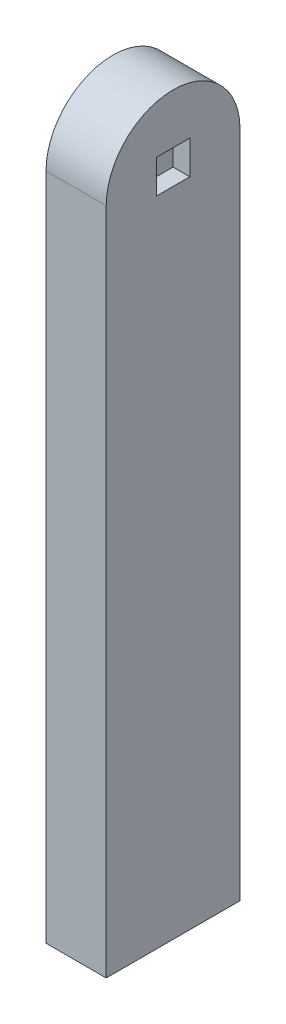
ISO-10303-21;
HEADER;
FILE_DESCRIPTION(('STEP AP214'),'2;1');
FILE_NAME('part.step','',(''),(''),'','','');
FILE_SCHEMA(('AUTOMOTIVE_DESIGN { 1 0 10303 214 1 1 1 1 }'));
ENDSEC;
DATA;
#1=APPLICATION_CONTEXT('core data for automotive mechanical design processes');
#2=APPLICATION_PROTOCOL_DEFINITION('international standard','automotive_design',2000,#1);
#3=PRODUCT_CONTEXT('',#1,'mechanical');
#4=PRODUCT('Part','Part','',(#3));
#5=PRODUCT_RELATED_PRODUCT_CATEGORY('part','',(#4));
#6=PRODUCT_DEFINITION_FORMATION('','',#4);
#7=PRODUCT_DEFINITION_CONTEXT('part definition',#1,'design');
#8=PRODUCT_DEFINITION('design','',#6,#7);
#9=PRODUCT_DEFINITION_SHAPE('','',#8);
#10=(LENGTH_UNIT() NAMED_UNIT(*) SI_UNIT(.MILLI.,.METRE.));
#11=(NAMED_UNIT(*) PLANE_ANGLE_UNIT() SI_UNIT($,.RADIAN.));
#12=(NAMED_UNIT(*) SI_UNIT($,.STERADIAN.) SOLID_ANGLE_UNIT());
#13=UNCERTAINTY_MEASURE_WITH_UNIT(LENGTH_MEASURE(1.E-05),#10,'distance_accuracy_value','');
#14=(GEOMETRIC_REPRESENTATION_CONTEXT(3) GLOBAL_UNCERTAINTY_ASSIGNED_CONTEXT((#13)) GLOBAL_UNIT_ASSIGNED_CONTEXT((#10,
#11,#12)) REPRESENTATION_CONTEXT('',''));
#15=CARTESIAN_POINT('',(0.,0.,0.));
#16=DIRECTION('',(0.,0.,1.));
#17=DIRECTION('',(1.,0.,0.));
#18=AXIS2_PLACEMENT_3D('',#15,#16,#17);
#19=CARTESIAN_POINT('',(-4.,0.,-5.));
#20=DIRECTION('',(0.,0.,1.));
#21=DIRECTION('',(1.,0.,0.));
#22=AXIS2_PLACEMENT_3D('',#19,#20,#21);
#23=PLANE('',#22);
#24=DIRECTION('',(0.,1.,0.));
#25=VECTOR('',#24,1.);
#26=CARTESIAN_POINT('',(-9.,0.,-5.));
#27=LINE('',#26,#25);
#28=CARTESIAN_POINT('',(-9.,-5.,-5.));
#29=VERTEX_POINT('',#28);
#30=CARTESIAN_POINT('',(-9.,5.,-5.));
#31=VERTEX_POINT('',#30);
#32=EDGE_CURVE('E254',#29,#31,#27,.T.);
#33=ORIENTED_EDGE('',*,*,#32,.F.);
#34=DIRECTION('',(-1.,0.,0.));
#35=VECTOR('',#34,1.);
#36=CARTESIAN_POINT('',(-4.,-5.,-5.));
#37=LINE('',#36,#35);
#38=CARTESIAN_POINT('',(-4.,-5.,-5.));
#39=VERTEX_POINT('',#38);
#40=EDGE_CURVE('E11',#39,#29,#37,.T.);
#41=ORIENTED_EDGE('',*,*,#40,.F.);
#42=DIRECTION('',(0.,1.,0.));
#43=VECTOR('',#42,1.);
#44=CARTESIAN_POINT('',(-4.,0.,-5.));
#45=LINE('',#44,#43);
#46=CARTESIAN_POINT('',(-4.,5.,-5.));
#47=VERTEX_POINT('',#46);
#48=EDGE_CURVE('E232',#39,#47,#45,.T.);
#49=ORIENTED_EDGE('',*,*,#48,.T.);
#50=DIRECTION('',(-1.,0.,0.));
#51=VECTOR('',#50,1.);
#52=CARTESIAN_POINT('',(-4.,5.,-5.));
#53=LINE('',#52,#51);
#54=EDGE_CURVE('E265',#47,#31,#53,.T.);
#55=ORIENTED_EDGE('',*,*,#54,.T.);
#56=EDGE_LOOP('',(#33,#41,#49,#55));
#57=FACE_BOUND('',#56,.T.);
#58=ADVANCED_FACE('F35',(#57),#23,.T.);
#59=CARTESIAN_POINT('',(-4.,-5.,0.));
#60=DIRECTION('',(0.,1.,0.));
#61=DIRECTION('',(0.,0.,1.));
#62=AXIS2_PLACEMENT_3D('',#59,#60,#61);
#63=PLANE('',#62);
#64=DIRECTION('',(0.,0.,-1.));
#65=VECTOR('',#64,1.);
#66=CARTESIAN_POINT('',(-9.,-5.,0.));
#67=LINE('',#66,#65);
#68=CARTESIAN_POINT('',(-9.,-5.,5.));
#69=VERTEX_POINT('',#68);
#70=EDGE_CURVE('E257',#69,#29,#67,.T.);
#71=ORIENTED_EDGE('',*,*,#70,.F.);
#72=DIRECTION('',(-1.,0.,0.));
#73=VECTOR('',#72,1.);
#74=CARTESIAN_POINT('',(-4.,-5.,5.));
#75=LINE('',#74,#73);
#76=CARTESIAN_POINT('',(-4.,-5.,5.));
#77=VERTEX_POINT('',#76);
#78=EDGE_CURVE('E44',#77,#69,#75,.T.);
#79=ORIENTED_EDGE('',*,*,#78,.F.);
#80=DIRECTION('',(0.,0.,-1.));
#81=VECTOR('',#80,1.);
#82=CARTESIAN_POINT('',(-4.,-5.,0.));
#83=LINE('',#82,#81);
#84=EDGE_CURVE('E235',#77,#39,#83,.T.);
#85=ORIENTED_EDGE('',*,*,#84,.T.);
#86=ORIENTED_EDGE('',*,*,#40,.T.);
#87=EDGE_LOOP('',(#71,#79,#85,#86));
#88=FACE_BOUND('',#87,.T.);
#89=ADVANCED_FACE('F322',(#88),#63,.T.);
#90=CARTESIAN_POINT('',(-4.,0.,5.));
#91=DIRECTION('',(0.,0.,1.));
#92=DIRECTION('',(1.,0.,0.));
#93=AXIS2_PLACEMENT_3D('',#90,#91,#92);
#94=PLANE('',#93);
#95=DIRECTION('',(0.,1.,0.));
#96=VECTOR('',#95,1.);
#97=CARTESIAN_POINT('',(-9.,0.,5.));
#98=LINE('',#97,#96);
#99=CARTESIAN_POINT('',(-9.,5.,5.));
#100=VERTEX_POINT('',#99);
#101=EDGE_CURVE('E260',#69,#100,#98,.T.);
#102=ORIENTED_EDGE('',*,*,#101,.T.);
#103=DIRECTION('',(-1.,0.,0.));
#104=VECTOR('',#103,1.);
#105=CARTESIAN_POINT('',(-4.,5.,5.));
#106=LINE('',#105,#104);
#107=CARTESIAN_POINT('',(-4.,5.,5.));
#108=VERTEX_POINT('',#107);
#109=EDGE_CURVE('E267',#108,#100,#106,.T.);
#110=ORIENTED_EDGE('',*,*,#109,.F.);
#111=DIRECTION('',(0.,1.,0.));
#112=VECTOR('',#111,1.);
#113=CARTESIAN_POINT('',(-4.,0.,5.));
#114=LINE('',#113,#112);
#115=EDGE_CURVE('E239',#77,#108,#114,.T.);
#116=ORIENTED_EDGE('',*,*,#115,.F.);
#117=ORIENTED_EDGE('',*,*,#78,.T.);
#118=EDGE_LOOP('',(#102,#110,#116,#117));
#119=FACE_BOUND('',#118,.T.);
#120=ADVANCED_FACE('F328',(#119),#94,.F.);
#121=CARTESIAN_POINT('',(-4.,0.,-20.));
#122=DIRECTION('',(0.,0.,-1.));
#123=DIRECTION('',(0.,1.,0.));
#124=AXIS2_PLACEMENT_3D('',#121,#122,#123);
#125=PLANE('',#124);
#126=DIRECTION('',(0.,-1.,0.));
#127=VECTOR('',#126,1.);
#128=CARTESIAN_POINT('',(-9.,0.,-20.));
#129=LINE('',#128,#127);
#130=CARTESIAN_POINT('',(-9.,0.,-20.));
#131=VERTEX_POINT('',#130);
#132=CARTESIAN_POINT('',(-9.,-200.,-20.));
#133=VERTEX_POINT('',#132);
#134=EDGE_CURVE('E224',#131,#133,#129,.T.);
#135=ORIENTED_EDGE('',*,*,#134,.F.);
#136=DIRECTION('',(-1.,0.,0.));
#137=VECTOR('',#136,1.);
#138=CARTESIAN_POINT('',(-4.,0.,-20.));
#139=LINE('',#138,#137);
#140=CARTESIAN_POINT('',(9.,0.,-20.));
#141=VERTEX_POINT('',#140);
#142=EDGE_CURVE('E39',#141,#131,#139,.T.);
#143=ORIENTED_EDGE('',*,*,#142,.F.);
#144=DIRECTION('',(0.,-1.,0.));
#145=VECTOR('',#144,1.);
#146=CARTESIAN_POINT('',(9.,0.,-20.));
#147=LINE('',#146,#145);
#148=CARTESIAN_POINT('',(9.,-200.,-20.));
#149=VERTEX_POINT('',#148);
#150=EDGE_CURVE('E190',#141,#149,#147,.T.);
#151=ORIENTED_EDGE('',*,*,#150,.T.);
#152=DIRECTION('',(-1.,0.,0.));
#153=VECTOR('',#152,1.);
#154=CARTESIAN_POINT('',(-4.,-200.,-20.));
#155=LINE('',#154,#153);
#156=EDGE_CURVE('E244',#149,#133,#155,.T.);
#157=ORIENTED_EDGE('',*,*,#156,.T.);
#158=EDGE_LOOP('',(#135,#143,#151,#157));
#159=FACE_BOUND('',#158,.T.);
#160=ADVANCED_FACE('F37',(#159),#125,.T.);
#161=CARTESIAN_POINT('',(-4.,0.,0.));
#162=DIRECTION('',(-1.,0.,0.));
#163=DIRECTION('',(0.,0.,1.));
#164=AXIS2_PLACEMENT_3D('',#161,#162,#163);
#165=CYLINDRICAL_SURFACE('',#164,20.);
#166=CARTESIAN_POINT('',(-9.,0.,0.));
#167=DIRECTION('',(1.,0.,0.));
#168=DIRECTION('',(0.,0.,-1.));
#169=AXIS2_PLACEMENT_3D('',#166,#167,#168);
#170=CIRCLE('',#169,20.);
#171=CARTESIAN_POINT('',(-9.,0.,20.));
#172=VERTEX_POINT('',#171);
#173=EDGE_CURVE('E247',#131,#172,#170,.T.);
#174=ORIENTED_EDGE('',*,*,#173,.T.);
#175=DIRECTION('',(-1.,0.,0.));
#176=VECTOR('',#175,1.);
#177=CARTESIAN_POINT('',(-4.,0.,20.));
#178=LINE('',#177,#176);
#179=CARTESIAN_POINT('',(9.,0.,20.));
#180=VERTEX_POINT('',#179);
#181=EDGE_CURVE('E274',#180,#172,#178,.T.);
#182=ORIENTED_EDGE('',*,*,#181,.F.);
#183=CARTESIAN_POINT('',(9.,0.,0.));
#184=DIRECTION('',(1.,0.,0.));
#185=DIRECTION('',(0.,0.,-1.));
#186=AXIS2_PLACEMENT_3D('',#183,#184,#185);
#187=CIRCLE('',#186,20.);
#188=EDGE_CURVE('E193',#141,#180,#187,.T.);
#189=ORIENTED_EDGE('',*,*,#188,.F.);
#190=ORIENTED_EDGE('',*,*,#142,.T.);
#191=EDGE_LOOP('',(#174,#182,#189,#190));
#192=FACE_BOUND('',#191,.T.);
#193=ADVANCED_FACE('F282',(#192),#165,.T.);
#194=CARTESIAN_POINT('',(-4.,0.,20.));
#195=DIRECTION('',(0.,0.,-1.));
#196=DIRECTION('',(0.,1.,0.));
#197=AXIS2_PLACEMENT_3D('',#194,#195,#196);
#198=PLANE('',#197);
#199=DIRECTION('',(0.,-1.,0.));
#200=VECTOR('',#199,1.);
#201=CARTESIAN_POINT('',(-9.,0.,20.));
#202=LINE('',#201,#200);
#203=CARTESIAN_POINT('',(-9.,-200.,20.));
#204=VERTEX_POINT('',#203);
#205=EDGE_CURVE('E249',#172,#204,#202,.T.);
#206=ORIENTED_EDGE('',*,*,#205,.T.);
#207=DIRECTION('',(-1.,0.,0.));
#208=VECTOR('',#207,1.);
#209=CARTESIAN_POINT('',(-4.,-200.,20.));
#210=LINE('',#209,#208);
#211=CARTESIAN_POINT('',(9.,-200.,20.));
#212=VERTEX_POINT('',#211);
#213=EDGE_CURVE('E272',#212,#204,#210,.T.);
#214=ORIENTED_EDGE('',*,*,#213,.F.);
#215=DIRECTION('',(0.,-1.,0.));
#216=VECTOR('',#215,1.);
#217=CARTESIAN_POINT('',(9.,0.,20.));
#218=LINE('',#217,#216);
#219=EDGE_CURVE('E196',#180,#212,#218,.T.);
#220=ORIENTED_EDGE('',*,*,#219,.F.);
#221=ORIENTED_EDGE('',*,*,#181,.T.);
#222=EDGE_LOOP('',(#206,#214,#220,#221));
#223=FACE_BOUND('',#222,.T.);
#224=ADVANCED_FACE('F293',(#223),#198,.F.);
#225=CARTESIAN_POINT('',(-4.,-200.,0.));
#226=DIRECTION('',(0.,1.,0.));
#227=DIRECTION('',(0.,0.,1.));
#228=AXIS2_PLACEMENT_3D('',#225,#226,#227);
#229=PLANE('',#228);
#230=DIRECTION('',(0.,0.,-1.));
#231=VECTOR('',#230,1.);
#232=CARTESIAN_POINT('',(-9.,-200.,0.));
#233=LINE('',#232,#231);
#234=EDGE_CURVE('E251',#204,#133,#233,.T.);
#235=ORIENTED_EDGE('',*,*,#234,.T.);
#236=ORIENTED_EDGE('',*,*,#156,.F.);
#237=DIRECTION('',(0.,0.,-1.));
#238=VECTOR('',#237,1.);
#239=CARTESIAN_POINT('',(9.,-200.,0.));
#240=LINE('',#239,#238);
#241=EDGE_CURVE('E199',#212,#149,#240,.T.);
#242=ORIENTED_EDGE('',*,*,#241,.F.);
#243=ORIENTED_EDGE('',*,*,#213,.T.);
#244=EDGE_LOOP('',(#235,#236,#242,#243));
#245=FACE_BOUND('',#244,.T.);
#246=ADVANCED_FACE('F292',(#245),#229,.F.);
#247=CARTESIAN_POINT('',(-4.,5.,0.));
#248=DIRECTION('',(0.,1.,0.));
#249=DIRECTION('',(0.,0.,1.));
#250=AXIS2_PLACEMENT_3D('',#247,#248,#249);
#251=PLANE('',#250);
#252=DIRECTION('',(0.,0.,-1.));
#253=VECTOR('',#252,1.);
#254=CARTESIAN_POINT('',(-9.,5.,0.));
#255=LINE('',#254,#253);
#256=EDGE_CURVE('E236',#100,#31,#255,.T.);
#257=ORIENTED_EDGE('',*,*,#256,.T.);
#258=ORIENTED_EDGE('',*,*,#54,.F.);
#259=DIRECTION('',(0.,0.,-1.));
#260=VECTOR('',#259,1.);
#261=CARTESIAN_POINT('',(-4.,5.,0.));
#262=LINE('',#261,#260);
#263=EDGE_CURVE('E242',#108,#47,#262,.T.);
#264=ORIENTED_EDGE('',*,*,#263,.F.);
#265=ORIENTED_EDGE('',*,*,#109,.T.);
#266=EDGE_LOOP('',(#257,#258,#264,#265));
#267=FACE_BOUND('',#266,.T.);
#268=ADVANCED_FACE('F336',(#267),#251,.F.);
#269=CARTESIAN_POINT('',(-4.,0.,0.));
#270=DIRECTION('',(1.,0.,0.));
#271=DIRECTION('',(0.,0.,-1.));
#272=AXIS2_PLACEMENT_3D('',#269,#270,#271);
#273=PLANE('',#272);
#274=CARTESIAN_POINT('',(-4.,0.,0.));
#275=DIRECTION('',(1.,0.,0.));
#276=DIRECTION('',(0.,0.,-1.));
#277=AXIS2_PLACEMENT_3D('',#274,#275,#276);
#278=CIRCLE('',#277,15.);
#279=CARTESIAN_POINT('',(-4.,0.,-15.));
#280=VERTEX_POINT('',#279);
#281=CARTESIAN_POINT('',(-4.,0.,15.));
#282=VERTEX_POINT('',#281);
#283=EDGE_CURVE('E222',#280,#282,#278,.T.);
#284=ORIENTED_EDGE('',*,*,#283,.T.);
#285=DIRECTION('',(0.,-1.,0.));
#286=VECTOR('',#285,1.);
#287=CARTESIAN_POINT('',(-4.,0.,15.));
#288=LINE('',#287,#286);
#289=CARTESIAN_POINT('',(-4.,-195.,15.));
#290=VERTEX_POINT('',#289);
#291=EDGE_CURVE('E155',#282,#290,#288,.T.);
#292=ORIENTED_EDGE('',*,*,#291,.T.);
#293=DIRECTION('',(0.,0.,-1.));
#294=VECTOR('',#293,1.);
#295=CARTESIAN_POINT('',(-4.,-195.,0.));
#296=LINE('',#295,#294);
#297=CARTESIAN_POINT('',(-4.,-195.,-15.));
#298=VERTEX_POINT('',#297);
#299=EDGE_CURVE('E57',#290,#298,#296,.T.);
#300=ORIENTED_EDGE('',*,*,#299,.T.);
#301=DIRECTION('',(0.,-1.,0.));
#302=VECTOR('',#301,1.);
#303=CARTESIAN_POINT('',(-4.,0.,-15.));
#304=LINE('',#303,#302);
#305=EDGE_CURVE('E52',#280,#298,#304,.T.);
#306=ORIENTED_EDGE('',*,*,#305,.F.);
#307=EDGE_LOOP('',(#284,#292,#300,#306));
#308=FACE_BOUND('',#307,.T.);
#309=ORIENTED_EDGE('',*,*,#48,.F.);
#310=ORIENTED_EDGE('',*,*,#84,.F.);
#311=ORIENTED_EDGE('',*,*,#115,.T.);
#312=ORIENTED_EDGE('',*,*,#263,.T.);
#313=EDGE_LOOP('',(#309,#310,#311,#312));
#314=FACE_BOUND('',#313,.T.);
#315=ADVANCED_FACE('F351',(#308,#314),#273,.T.);
#316=CARTESIAN_POINT('',(-9.,0.,0.));
#317=DIRECTION('',(1.,0.,0.));
#318=DIRECTION('',(0.,0.,-1.));
#319=AXIS2_PLACEMENT_3D('',#316,#317,#318);
#320=PLANE('',#319);
#321=ORIENTED_EDGE('',*,*,#134,.T.);
#322=ORIENTED_EDGE('',*,*,#234,.F.);
#323=ORIENTED_EDGE('',*,*,#205,.F.);
#324=ORIENTED_EDGE('',*,*,#173,.F.);
#325=EDGE_LOOP('',(#321,#322,#323,#324));
#326=FACE_BOUND('',#325,.T.);
#327=ORIENTED_EDGE('',*,*,#32,.T.);
#328=ORIENTED_EDGE('',*,*,#256,.F.);
#329=ORIENTED_EDGE('',*,*,#101,.F.);
#330=ORIENTED_EDGE('',*,*,#70,.T.);
#331=EDGE_LOOP('',(#327,#328,#329,#330));
#332=FACE_BOUND('',#331,.T.);
#333=ADVANCED_FACE('F287',(#326,#332),#320,.F.);
#334=CARTESIAN_POINT('',(223.606797749979,0.,0.));
#335=DIRECTION('',(-1.,0.,0.));
#336=DIRECTION('',(0.,0.,1.));
#337=AXIS2_PLACEMENT_3D('',#334,#335,#336);
#338=CYLINDRICAL_SURFACE('',#337,15.);
#339=DIRECTION('',(-1.,0.,0.));
#340=VECTOR('',#339,1.);
#341=CARTESIAN_POINT('',(223.606797749979,0.,-15.));
#342=LINE('',#341,#340);
#343=CARTESIAN_POINT('',(4.,0.,-15.));
#344=VERTEX_POINT('',#343);
#345=EDGE_CURVE('E159',#344,#280,#342,.T.);
#346=ORIENTED_EDGE('',*,*,#345,.F.);
#347=CARTESIAN_POINT('',(4.,0.,0.));
#348=DIRECTION('',(1.,0.,0.));
#349=DIRECTION('',(0.,0.,-1.));
#350=AXIS2_PLACEMENT_3D('',#347,#348,#349);
#351=CIRCLE('',#350,15.);
#352=CARTESIAN_POINT('',(4.,0.,15.));
#353=VERTEX_POINT('',#352);
#354=EDGE_CURVE('E167',#344,#353,#351,.T.);
#355=ORIENTED_EDGE('',*,*,#354,.T.);
#356=DIRECTION('',(-1.,0.,0.));
#357=VECTOR('',#356,1.);
#358=CARTESIAN_POINT('',(223.606797749979,0.,15.));
#359=LINE('',#358,#357);
#360=EDGE_CURVE('E149',#353,#282,#359,.T.);
#361=ORIENTED_EDGE('',*,*,#360,.T.);
#362=ORIENTED_EDGE('',*,*,#283,.F.);
#363=EDGE_LOOP('',(#346,#355,#361,#362));
#364=FACE_BOUND('',#363,.T.);
#365=ADVANCED_FACE('F171',(#364),#338,.F.);
#366=CARTESIAN_POINT('',(223.606797749979,0.,-15.));
#367=DIRECTION('',(0.,0.,-1.));
#368=DIRECTION('',(0.,1.,0.));
#369=AXIS2_PLACEMENT_3D('',#366,#367,#368);
#370=PLANE('',#369);
#371=DIRECTION('',(-1.,0.,0.));
#372=VECTOR('',#371,1.);
#373=CARTESIAN_POINT('',(223.606797749979,-195.,-15.));
#374=LINE('',#373,#372);
#375=CARTESIAN_POINT('',(4.,-195.,-15.));
#376=VERTEX_POINT('',#375);
#377=EDGE_CURVE('E226',#376,#298,#374,.T.);
#378=ORIENTED_EDGE('',*,*,#377,.F.);
#379=DIRECTION('',(0.,-1.,0.));
#380=VECTOR('',#379,1.);
#381=CARTESIAN_POINT('',(4.,0.,-15.));
#382=LINE('',#381,#380);
#383=EDGE_CURVE('E173',#344,#376,#382,.T.);
#384=ORIENTED_EDGE('',*,*,#383,.F.);
#385=ORIENTED_EDGE('',*,*,#345,.T.);
#386=ORIENTED_EDGE('',*,*,#305,.T.);
#387=EDGE_LOOP('',(#378,#384,#385,#386));
#388=FACE_BOUND('',#387,.T.);
#389=ADVANCED_FACE('F359',(#388),#370,.F.);
#390=CARTESIAN_POINT('',(223.606797749979,-195.,0.));
#391=DIRECTION('',(0.,1.,0.));
#392=DIRECTION('',(0.,0.,1.));
#393=AXIS2_PLACEMENT_3D('',#390,#391,#392);
#394=PLANE('',#393);
#395=DIRECTION('',(-1.,0.,0.));
#396=VECTOR('',#395,1.);
#397=CARTESIAN_POINT('',(223.606797749979,-195.,15.));
#398=LINE('',#397,#396);
#399=CARTESIAN_POINT('',(4.,-195.,15.));
#400=VERTEX_POINT('',#399);
#401=EDGE_CURVE('E228',#400,#290,#398,.T.);
#402=ORIENTED_EDGE('',*,*,#401,.F.);
#403=DIRECTION('',(0.,0.,-1.));
#404=VECTOR('',#403,1.);
#405=CARTESIAN_POINT('',(4.,-195.,0.));
#406=LINE('',#405,#404);
#407=EDGE_CURVE('E169',#400,#376,#406,.T.);
#408=ORIENTED_EDGE('',*,*,#407,.T.);
#409=ORIENTED_EDGE('',*,*,#377,.T.);
#410=ORIENTED_EDGE('',*,*,#299,.F.);
#411=EDGE_LOOP('',(#402,#408,#409,#410));
#412=FACE_BOUND('',#411,.T.);
#413=ADVANCED_FACE('F362',(#412),#394,.T.);
#414=CARTESIAN_POINT('',(223.606797749979,0.,15.));
#415=DIRECTION('',(0.,0.,-1.));
#416=DIRECTION('',(0.,1.,0.));
#417=AXIS2_PLACEMENT_3D('',#414,#415,#416);
#418=PLANE('',#417);
#419=ORIENTED_EDGE('',*,*,#360,.F.);
#420=DIRECTION('',(0.,-1.,0.));
#421=VECTOR('',#420,1.);
#422=CARTESIAN_POINT('',(4.,0.,15.));
#423=LINE('',#422,#421);
#424=EDGE_CURVE('E153',#353,#400,#423,.T.);
#425=ORIENTED_EDGE('',*,*,#424,.T.);
#426=ORIENTED_EDGE('',*,*,#401,.T.);
#427=ORIENTED_EDGE('',*,*,#291,.F.);
#428=EDGE_LOOP('',(#419,#425,#426,#427));
#429=FACE_BOUND('',#428,.T.);
#430=ADVANCED_FACE('F151',(#429),#418,.T.);
#431=CARTESIAN_POINT('',(4.,0.,-5.));
#432=DIRECTION('',(0.,0.,1.));
#433=DIRECTION('',(-1.,0.,0.));
#434=AXIS2_PLACEMENT_3D('',#431,#432,#433);
#435=PLANE('',#434);
#436=DIRECTION('',(0.,1.,0.));
#437=VECTOR('',#436,1.);
#438=CARTESIAN_POINT('',(9.,0.,-5.));
#439=LINE('',#438,#437);
#440=CARTESIAN_POINT('',(9.,-5.,-5.));
#441=VERTEX_POINT('',#440);
#442=CARTESIAN_POINT('',(9.,5.,-5.));
#443=VERTEX_POINT('',#442);
#444=EDGE_CURVE('E202',#441,#443,#439,.T.);
#445=ORIENTED_EDGE('',*,*,#444,.T.);
#446=DIRECTION('',(1.,0.,0.));
#447=VECTOR('',#446,1.);
#448=CARTESIAN_POINT('',(4.,5.,-5.));
#449=LINE('',#448,#447);
#450=CARTESIAN_POINT('',(4.,5.,-5.));
#451=VERTEX_POINT('',#450);
#452=EDGE_CURVE('E189',#451,#443,#449,.T.);
#453=ORIENTED_EDGE('',*,*,#452,.F.);
#454=DIRECTION('',(0.,1.,0.));
#455=VECTOR('',#454,1.);
#456=CARTESIAN_POINT('',(4.,0.,-5.));
#457=LINE('',#456,#455);
#458=CARTESIAN_POINT('',(4.,-5.,-5.));
#459=VERTEX_POINT('',#458);
#460=EDGE_CURVE('E178',#459,#451,#457,.T.);
#461=ORIENTED_EDGE('',*,*,#460,.F.);
#462=DIRECTION('',(1.,0.,0.));
#463=VECTOR('',#462,1.);
#464=CARTESIAN_POINT('',(4.,-5.,-5.));
#465=LINE('',#464,#463);
#466=EDGE_CURVE('E160',#459,#441,#465,.T.);
#467=ORIENTED_EDGE('',*,*,#466,.T.);
#468=EDGE_LOOP('',(#445,#453,#461,#467));
#469=FACE_BOUND('',#468,.T.);
#470=ADVANCED_FACE('F303',(#469),#435,.T.);
#471=CARTESIAN_POINT('',(4.,-5.,0.));
#472=DIRECTION('',(0.,1.,0.));
#473=DIRECTION('',(0.,0.,1.));
#474=AXIS2_PLACEMENT_3D('',#471,#472,#473);
#475=PLANE('',#474);
#476=DIRECTION('',(0.,0.,-1.));
#477=VECTOR('',#476,1.);
#478=CARTESIAN_POINT('',(9.,-5.,0.));
#479=LINE('',#478,#477);
#480=CARTESIAN_POINT('',(9.,-5.,5.));
#481=VERTEX_POINT('',#480);
#482=EDGE_CURVE('E205',#481,#441,#479,.T.);
#483=ORIENTED_EDGE('',*,*,#482,.T.);
#484=ORIENTED_EDGE('',*,*,#466,.F.);
#485=DIRECTION('',(0.,0.,-1.));
#486=VECTOR('',#485,1.);
#487=CARTESIAN_POINT('',(4.,-5.,0.));
#488=LINE('',#487,#486);
#489=CARTESIAN_POINT('',(4.,-5.,5.));
#490=VERTEX_POINT('',#489);
#491=EDGE_CURVE('E181',#490,#459,#488,.T.);
#492=ORIENTED_EDGE('',*,*,#491,.F.);
#493=DIRECTION('',(1.,0.,0.));
#494=VECTOR('',#493,1.);
#495=CARTESIAN_POINT('',(4.,-5.,5.));
#496=LINE('',#495,#494);
#497=EDGE_CURVE('E216',#490,#481,#496,.T.);
#498=ORIENTED_EDGE('',*,*,#497,.T.);
#499=EDGE_LOOP('',(#483,#484,#492,#498));
#500=FACE_BOUND('',#499,.T.);
#501=ADVANCED_FACE('F308',(#500),#475,.T.);
#502=CARTESIAN_POINT('',(4.,0.,5.));
#503=DIRECTION('',(0.,0.,1.));
#504=DIRECTION('',(-1.,0.,0.));
#505=AXIS2_PLACEMENT_3D('',#502,#503,#504);
#506=PLANE('',#505);
#507=DIRECTION('',(0.,1.,0.));
#508=VECTOR('',#507,1.);
#509=CARTESIAN_POINT('',(9.,0.,5.));
#510=LINE('',#509,#508);
#511=CARTESIAN_POINT('',(9.,5.,5.));
#512=VERTEX_POINT('',#511);
#513=EDGE_CURVE('E207',#481,#512,#510,.T.);
#514=ORIENTED_EDGE('',*,*,#513,.F.);
#515=ORIENTED_EDGE('',*,*,#497,.F.);
#516=DIRECTION('',(0.,1.,0.));
#517=VECTOR('',#516,1.);
#518=CARTESIAN_POINT('',(4.,0.,5.));
#519=LINE('',#518,#517);
#520=CARTESIAN_POINT('',(4.,5.,5.));
#521=VERTEX_POINT('',#520);
#522=EDGE_CURVE('E184',#490,#521,#519,.T.);
#523=ORIENTED_EDGE('',*,*,#522,.T.);
#524=DIRECTION('',(1.,0.,0.));
#525=VECTOR('',#524,1.);
#526=CARTESIAN_POINT('',(4.,5.,5.));
#527=LINE('',#526,#525);
#528=EDGE_CURVE('E213',#521,#512,#527,.T.);
#529=ORIENTED_EDGE('',*,*,#528,.T.);
#530=EDGE_LOOP('',(#514,#515,#523,#529));
#531=FACE_BOUND('',#530,.T.);
#532=ADVANCED_FACE('F311',(#531),#506,.F.);
#533=CARTESIAN_POINT('',(4.,5.,0.));
#534=DIRECTION('',(0.,1.,0.));
#535=DIRECTION('',(0.,0.,1.));
#536=AXIS2_PLACEMENT_3D('',#533,#534,#535);
#537=PLANE('',#536);
#538=DIRECTION('',(0.,0.,-1.));
#539=VECTOR('',#538,1.);
#540=CARTESIAN_POINT('',(9.,5.,0.));
#541=LINE('',#540,#539);
#542=EDGE_CURVE('E182',#512,#443,#541,.T.);
#543=ORIENTED_EDGE('',*,*,#542,.F.);
#544=ORIENTED_EDGE('',*,*,#528,.F.);
#545=DIRECTION('',(0.,0.,-1.));
#546=VECTOR('',#545,1.);
#547=CARTESIAN_POINT('',(4.,5.,0.));
#548=LINE('',#547,#546);
#549=EDGE_CURVE('E187',#521,#451,#548,.T.);
#550=ORIENTED_EDGE('',*,*,#549,.T.);
#551=ORIENTED_EDGE('',*,*,#452,.T.);
#552=EDGE_LOOP('',(#543,#544,#550,#551));
#553=FACE_BOUND('',#552,.T.);
#554=ADVANCED_FACE('F314',(#553),#537,.F.);
#555=CARTESIAN_POINT('',(4.,0.,0.));
#556=DIRECTION('',(-1.,0.,0.));
#557=DIRECTION('',(0.,0.,-1.));
#558=AXIS2_PLACEMENT_3D('',#555,#556,#557);
#559=PLANE('',#558);
#560=ORIENTED_EDGE('',*,*,#354,.F.);
#561=ORIENTED_EDGE('',*,*,#383,.T.);
#562=ORIENTED_EDGE('',*,*,#407,.F.);
#563=ORIENTED_EDGE('',*,*,#424,.F.);
#564=EDGE_LOOP('',(#560,#561,#562,#563));
#565=FACE_BOUND('',#564,.T.);
#566=ORIENTED_EDGE('',*,*,#460,.T.);
#567=ORIENTED_EDGE('',*,*,#549,.F.);
#568=ORIENTED_EDGE('',*,*,#522,.F.);
#569=ORIENTED_EDGE('',*,*,#491,.T.);
#570=EDGE_LOOP('',(#566,#567,#568,#569));
#571=FACE_BOUND('',#570,.T.);
#572=ADVANCED_FACE('F164',(#565,#571),#559,.T.);
#573=CARTESIAN_POINT('',(9.,0.,0.));
#574=DIRECTION('',(-1.,0.,0.));
#575=DIRECTION('',(0.,0.,-1.));
#576=AXIS2_PLACEMENT_3D('',#573,#574,#575);
#577=PLANE('',#576);
#578=ORIENTED_EDGE('',*,*,#150,.F.);
#579=ORIENTED_EDGE('',*,*,#188,.T.);
#580=ORIENTED_EDGE('',*,*,#219,.T.);
#581=ORIENTED_EDGE('',*,*,#241,.T.);
#582=EDGE_LOOP('',(#578,#579,#580,#581));
#583=FACE_BOUND('',#582,.T.);
#584=ORIENTED_EDGE('',*,*,#444,.F.);
#585=ORIENTED_EDGE('',*,*,#482,.F.);
#586=ORIENTED_EDGE('',*,*,#513,.T.);
#587=ORIENTED_EDGE('',*,*,#542,.T.);
#588=EDGE_LOOP('',(#584,#585,#586,#587));
#589=FACE_BOUND('',#588,.T.);
#590=ADVANCED_FACE('F295',(#583,#589),#577,.F.);
#591=CLOSED_SHELL('',(#58,#89,#120,#160,#193,#224,#246,#268,#315,#333,#365,#389,#413,#430,#470,
#501,#532,#554,#572,#590));
#592=MANIFOLD_SOLID_BREP('B2',#591);
#593=ADVANCED_BREP_SHAPE_REPRESENTATION('',(#18,#592),#14);
#594=SHAPE_DEFINITION_REPRESENTATION(#9,#593);
ENDSEC;
END-ISO-10303-21;
